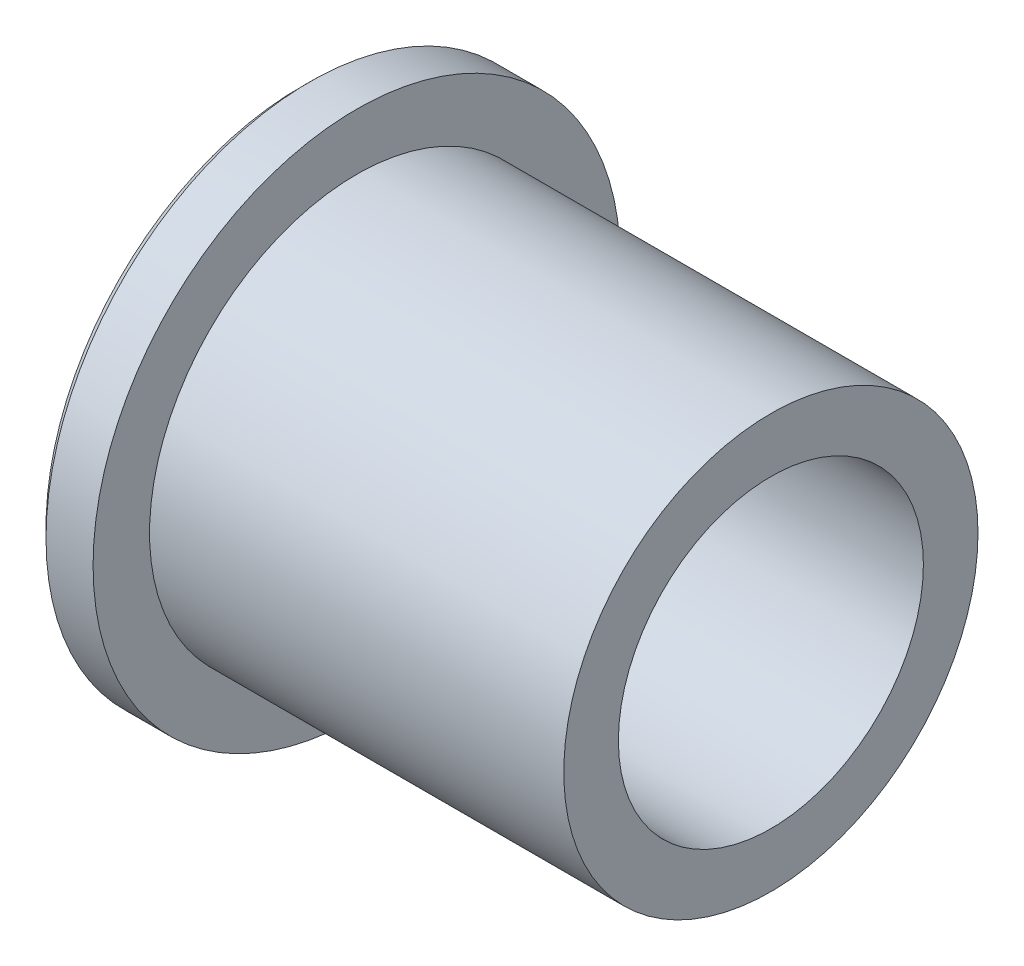
ISO-10303-21;
HEADER;
FILE_DESCRIPTION(('STEP AP214'),'2;1');
FILE_NAME('part.step','',(''),(''),'','','');
FILE_SCHEMA(('AUTOMOTIVE_DESIGN { 1 0 10303 214 1 1 1 1 }'));
ENDSEC;
DATA;
#1=APPLICATION_CONTEXT('core data for automotive mechanical design processes');
#2=APPLICATION_PROTOCOL_DEFINITION('international standard','automotive_design',2000,#1);
#3=PRODUCT_CONTEXT('',#1,'mechanical');
#4=PRODUCT('Part','Part','',(#3));
#5=PRODUCT_RELATED_PRODUCT_CATEGORY('part','',(#4));
#6=PRODUCT_DEFINITION_FORMATION('','',#4);
#7=PRODUCT_DEFINITION_CONTEXT('part definition',#1,'design');
#8=PRODUCT_DEFINITION('design','',#6,#7);
#9=PRODUCT_DEFINITION_SHAPE('','',#8);
#10=(LENGTH_UNIT() NAMED_UNIT(*) SI_UNIT(.MILLI.,.METRE.));
#11=(NAMED_UNIT(*) PLANE_ANGLE_UNIT() SI_UNIT($,.RADIAN.));
#12=(NAMED_UNIT(*) SI_UNIT($,.STERADIAN.) SOLID_ANGLE_UNIT());
#13=UNCERTAINTY_MEASURE_WITH_UNIT(LENGTH_MEASURE(1.E-05),#10,'distance_accuracy_value','');
#14=(GEOMETRIC_REPRESENTATION_CONTEXT(3) GLOBAL_UNCERTAINTY_ASSIGNED_CONTEXT((#13)) GLOBAL_UNIT_ASSIGNED_CONTEXT((#10,
#11,#12)) REPRESENTATION_CONTEXT('',''));
#15=CARTESIAN_POINT('',(0.,0.,0.));
#16=DIRECTION('',(0.,0.,1.));
#17=DIRECTION('',(1.,0.,0.));
#18=AXIS2_PLACEMENT_3D('',#15,#16,#17);
#19=CARTESIAN_POINT('',(3.,0.,0.));
#20=DIRECTION('',(1.,0.,0.));
#21=DIRECTION('',(0.,0.,-1.));
#22=AXIS2_PLACEMENT_3D('',#19,#20,#21);
#23=PLANE('',#22);
#24=CARTESIAN_POINT('',(3.,0.,0.));
#25=DIRECTION('',(1.,0.,0.));
#26=DIRECTION('',(0.,0.,-1.));
#27=AXIS2_PLACEMENT_3D('',#24,#25,#26);
#28=CIRCLE('',#27,14.);
#29=CARTESIAN_POINT('',(3.,0.,-14.));
#30=VERTEX_POINT('',#29);
#31=EDGE_CURVE('E53',#30,#30,#28,.T.);
#32=ORIENTED_EDGE('',*,*,#31,.T.);
#33=EDGE_LOOP('',(#32));
#34=FACE_BOUND('',#33,.T.);
#35=CARTESIAN_POINT('',(3.,0.,0.));
#36=DIRECTION('',(1.,0.,0.));
#37=DIRECTION('',(0.,0.,-1.));
#38=AXIS2_PLACEMENT_3D('',#35,#36,#37);
#39=CIRCLE('',#38,11.);
#40=CARTESIAN_POINT('',(3.,0.,-11.));
#41=VERTEX_POINT('',#40);
#42=EDGE_CURVE('E63',#41,#41,#39,.T.);
#43=ORIENTED_EDGE('',*,*,#42,.F.);
#44=EDGE_LOOP('',(#43));
#45=FACE_BOUND('',#44,.T.);
#46=ADVANCED_FACE('F42',(#34,#45),#23,.T.);
#47=CARTESIAN_POINT('',(0.,0.,0.));
#48=DIRECTION('',(1.,0.,0.));
#49=DIRECTION('',(0.,0.,-1.));
#50=AXIS2_PLACEMENT_3D('',#47,#48,#49);
#51=PLANE('',#50);
#52=CARTESIAN_POINT('',(0.,0.,0.));
#53=DIRECTION('',(1.,0.,0.));
#54=DIRECTION('',(0.,0.,-1.));
#55=AXIS2_PLACEMENT_3D('',#52,#53,#54);
#56=CIRCLE('',#55,13.5);
#57=CARTESIAN_POINT('',(0.,0.,-13.5));
#58=VERTEX_POINT('',#57);
#59=EDGE_CURVE('E12',#58,#58,#56,.F.);
#60=ORIENTED_EDGE('',*,*,#59,.T.);
#61=EDGE_LOOP('',(#60));
#62=FACE_BOUND('',#61,.T.);
#63=CARTESIAN_POINT('',(0.,0.,0.));
#64=DIRECTION('',(1.,0.,0.));
#65=DIRECTION('',(0.,0.,-1.));
#66=AXIS2_PLACEMENT_3D('',#63,#64,#65);
#67=CIRCLE('',#66,8.1);
#68=CARTESIAN_POINT('',(0.,0.,-8.1));
#69=VERTEX_POINT('',#68);
#70=EDGE_CURVE('E57',#69,#69,#67,.T.);
#71=ORIENTED_EDGE('',*,*,#70,.T.);
#72=EDGE_LOOP('',(#71));
#73=FACE_BOUND('',#72,.T.);
#74=ADVANCED_FACE('F89',(#62,#73),#51,.F.);
#75=CARTESIAN_POINT('',(3.,0.,0.));
#76=DIRECTION('',(-1.,0.,0.));
#77=DIRECTION('',(0.,0.,1.));
#78=AXIS2_PLACEMENT_3D('',#75,#76,#77);
#79=CYLINDRICAL_SURFACE('',#78,14.);
#80=CARTESIAN_POINT('',(0.499999999999999,0.,0.));
#81=DIRECTION('',(1.,0.,0.));
#82=DIRECTION('',(0.,0.,-1.));
#83=AXIS2_PLACEMENT_3D('',#80,#81,#82);
#84=CIRCLE('',#83,14.);
#85=CARTESIAN_POINT('',(0.499999999999999,0.,-14.));
#86=VERTEX_POINT('',#85);
#87=EDGE_CURVE('E49',#86,#86,#84,.T.);
#88=ORIENTED_EDGE('',*,*,#87,.T.);
#89=EDGE_LOOP('',(#88));
#90=FACE_BOUND('',#89,.T.);
#91=ORIENTED_EDGE('',*,*,#31,.F.);
#92=EDGE_LOOP('',(#91));
#93=FACE_BOUND('',#92,.T.);
#94=ADVANCED_FACE('F85',(#90,#93),#79,.T.);
#95=CARTESIAN_POINT('',(3.,0.,0.));
#96=DIRECTION('',(-1.,0.,0.));
#97=DIRECTION('',(0.,0.,1.));
#98=AXIS2_PLACEMENT_3D('',#95,#96,#97);
#99=CYLINDRICAL_SURFACE('',#98,8.1);
#100=ORIENTED_EDGE('',*,*,#70,.F.);
#101=EDGE_LOOP('',(#100));
#102=FACE_BOUND('',#101,.T.);
#103=CARTESIAN_POINT('',(25.,0.,0.));
#104=DIRECTION('',(1.,0.,0.));
#105=DIRECTION('',(0.,0.,-1.));
#106=AXIS2_PLACEMENT_3D('',#103,#104,#105);
#107=CIRCLE('',#106,8.1);
#108=CARTESIAN_POINT('',(25.,0.,-8.1));
#109=VERTEX_POINT('',#108);
#110=EDGE_CURVE('E66',#109,#109,#107,.T.);
#111=ORIENTED_EDGE('',*,*,#110,.T.);
#112=EDGE_LOOP('',(#111));
#113=FACE_BOUND('',#112,.T.);
#114=ADVANCED_FACE('F72',(#102,#113),#99,.F.);
#115=CARTESIAN_POINT('',(25.,0.,0.));
#116=DIRECTION('',(1.,0.,0.));
#117=DIRECTION('',(0.,0.,-1.));
#118=AXIS2_PLACEMENT_3D('',#115,#116,#117);
#119=PLANE('',#118);
#120=CARTESIAN_POINT('',(25.,0.,0.));
#121=DIRECTION('',(1.,0.,0.));
#122=DIRECTION('',(0.,0.,-1.));
#123=AXIS2_PLACEMENT_3D('',#120,#121,#122);
#124=CIRCLE('',#123,11.);
#125=CARTESIAN_POINT('',(25.,0.,-11.));
#126=VERTEX_POINT('',#125);
#127=EDGE_CURVE('E62',#126,#126,#124,.T.);
#128=ORIENTED_EDGE('',*,*,#127,.T.);
#129=EDGE_LOOP('',(#128));
#130=FACE_BOUND('',#129,.T.);
#131=ORIENTED_EDGE('',*,*,#110,.F.);
#132=EDGE_LOOP('',(#131));
#133=FACE_BOUND('',#132,.T.);
#134=ADVANCED_FACE('F74',(#130,#133),#119,.T.);
#135=CARTESIAN_POINT('',(25.,0.,0.));
#136=DIRECTION('',(-1.,0.,0.));
#137=DIRECTION('',(0.,0.,1.));
#138=AXIS2_PLACEMENT_3D('',#135,#136,#137);
#139=CYLINDRICAL_SURFACE('',#138,11.);
#140=ORIENTED_EDGE('',*,*,#127,.F.);
#141=EDGE_LOOP('',(#140));
#142=FACE_BOUND('',#141,.T.);
#143=ORIENTED_EDGE('',*,*,#42,.T.);
#144=EDGE_LOOP('',(#143));
#145=FACE_BOUND('',#144,.T.);
#146=ADVANCED_FACE('F76',(#142,#145),#139,.T.);
#147=CARTESIAN_POINT('',(0.499999999999999,0.,0.));
#148=DIRECTION('',(1.,0.,0.));
#149=DIRECTION('',(0.,0.,-1.));
#150=AXIS2_PLACEMENT_3D('',#147,#148,#149);
#151=CONICAL_SURFACE('',#150,14.,0.785398163397455);
#152=ORIENTED_EDGE('',*,*,#59,.F.);
#153=EDGE_LOOP('',(#152));
#154=FACE_BOUND('',#153,.T.);
#155=ORIENTED_EDGE('',*,*,#87,.F.);
#156=EDGE_LOOP('',(#155));
#157=FACE_BOUND('',#156,.T.);
#158=ADVANCED_FACE('F44',(#154,#157),#151,.T.);
#159=CLOSED_SHELL('',(#46,#74,#94,#114,#134,#146,#158));
#160=MANIFOLD_SOLID_BREP('B2',#159);
#161=ADVANCED_BREP_SHAPE_REPRESENTATION('',(#18,#160),#14);
#162=SHAPE_DEFINITION_REPRESENTATION(#9,#161);
ENDSEC;
END-ISO-10303-21;
